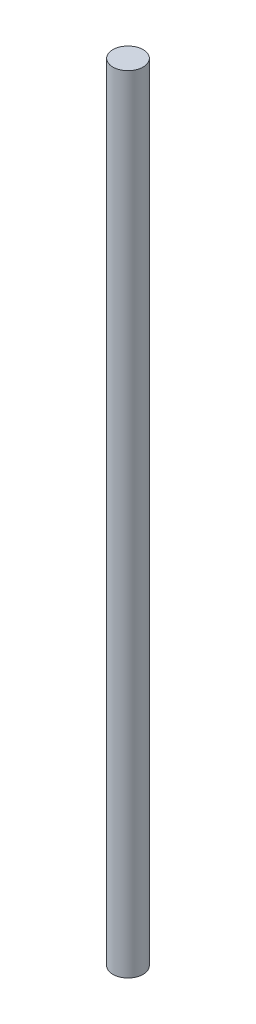
ISO-10303-21;
HEADER;
FILE_DESCRIPTION(('STEP AP214'),'2;1');
FILE_NAME('part.step','',(''),(''),'','','');
FILE_SCHEMA(('AUTOMOTIVE_DESIGN { 1 0 10303 214 1 1 1 1 }'));
ENDSEC;
DATA;
#1=APPLICATION_CONTEXT('core data for automotive mechanical design processes');
#2=APPLICATION_PROTOCOL_DEFINITION('international standard','automotive_design',2000,#1);
#3=PRODUCT_CONTEXT('',#1,'mechanical');
#4=PRODUCT('Part','Part','',(#3));
#5=PRODUCT_RELATED_PRODUCT_CATEGORY('part','',(#4));
#6=PRODUCT_DEFINITION_FORMATION('','',#4);
#7=PRODUCT_DEFINITION_CONTEXT('part definition',#1,'design');
#8=PRODUCT_DEFINITION('design','',#6,#7);
#9=PRODUCT_DEFINITION_SHAPE('','',#8);
#10=(LENGTH_UNIT() NAMED_UNIT(*) SI_UNIT(.MILLI.,.METRE.));
#11=(NAMED_UNIT(*) PLANE_ANGLE_UNIT() SI_UNIT($,.RADIAN.));
#12=(NAMED_UNIT(*) SI_UNIT($,.STERADIAN.) SOLID_ANGLE_UNIT());
#13=UNCERTAINTY_MEASURE_WITH_UNIT(LENGTH_MEASURE(1.E-05),#10,'distance_accuracy_value','');
#14=(GEOMETRIC_REPRESENTATION_CONTEXT(3) GLOBAL_UNCERTAINTY_ASSIGNED_CONTEXT((#13)) GLOBAL_UNIT_ASSIGNED_CONTEXT((#10,
#11,#12)) REPRESENTATION_CONTEXT('',''));
#15=CARTESIAN_POINT('',(0.,0.,0.));
#16=DIRECTION('',(0.,0.,1.));
#17=DIRECTION('',(1.,0.,0.));
#18=AXIS2_PLACEMENT_3D('',#15,#16,#17);
#19=CARTESIAN_POINT('',(0.,130.,0.));
#20=DIRECTION('',(0.,-1.,0.));
#21=DIRECTION('',(0.,0.,-1.));
#22=AXIS2_PLACEMENT_3D('',#19,#20,#21);
#23=CYLINDRICAL_SURFACE('',#22,2.5);
#24=CARTESIAN_POINT('',(0.,130.,0.));
#25=DIRECTION('',(0.,1.,0.));
#26=DIRECTION('',(0.,0.,1.));
#27=AXIS2_PLACEMENT_3D('',#24,#25,#26);
#28=CIRCLE('',#27,2.5);
#29=CARTESIAN_POINT('',(0.,130.,2.5));
#30=VERTEX_POINT('',#29);
#31=EDGE_CURVE('E10',#30,#30,#28,.T.);
#32=ORIENTED_EDGE('',*,*,#31,.F.);
#33=EDGE_LOOP('',(#32));
#34=FACE_BOUND('',#33,.T.);
#35=CARTESIAN_POINT('',(0.,0.,0.));
#36=DIRECTION('',(0.,1.,0.));
#37=DIRECTION('',(0.,0.,1.));
#38=AXIS2_PLACEMENT_3D('',#35,#36,#37);
#39=CIRCLE('',#38,2.5);
#40=CARTESIAN_POINT('',(0.,0.,2.5));
#41=VERTEX_POINT('',#40);
#42=EDGE_CURVE('E36',#41,#41,#39,.T.);
#43=ORIENTED_EDGE('',*,*,#42,.T.);
#44=EDGE_LOOP('',(#43));
#45=FACE_BOUND('',#44,.T.);
#46=ADVANCED_FACE('F33',(#34,#45),#23,.T.);
#47=CARTESIAN_POINT('',(0.,130.,0.));
#48=DIRECTION('',(0.,1.,0.));
#49=DIRECTION('',(0.,0.,1.));
#50=AXIS2_PLACEMENT_3D('',#47,#48,#49);
#51=PLANE('',#50);
#52=ORIENTED_EDGE('',*,*,#31,.T.);
#53=EDGE_LOOP('',(#52));
#54=FACE_BOUND('',#53,.T.);
#55=ADVANCED_FACE('F48',(#54),#51,.T.);
#56=CARTESIAN_POINT('',(0.,0.,0.));
#57=DIRECTION('',(0.,1.,0.));
#58=DIRECTION('',(0.,0.,1.));
#59=AXIS2_PLACEMENT_3D('',#56,#57,#58);
#60=PLANE('',#59);
#61=ORIENTED_EDGE('',*,*,#42,.F.);
#62=EDGE_LOOP('',(#61));
#63=FACE_BOUND('',#62,.T.);
#64=ADVANCED_FACE('F46',(#63),#60,.F.);
#65=CLOSED_SHELL('',(#46,#55,#64));
#66=MANIFOLD_SOLID_BREP('B2',#65);
#67=ADVANCED_BREP_SHAPE_REPRESENTATION('',(#18,#66),#14);
#68=SHAPE_DEFINITION_REPRESENTATION(#9,#67);
ENDSEC;
END-ISO-10303-21;
